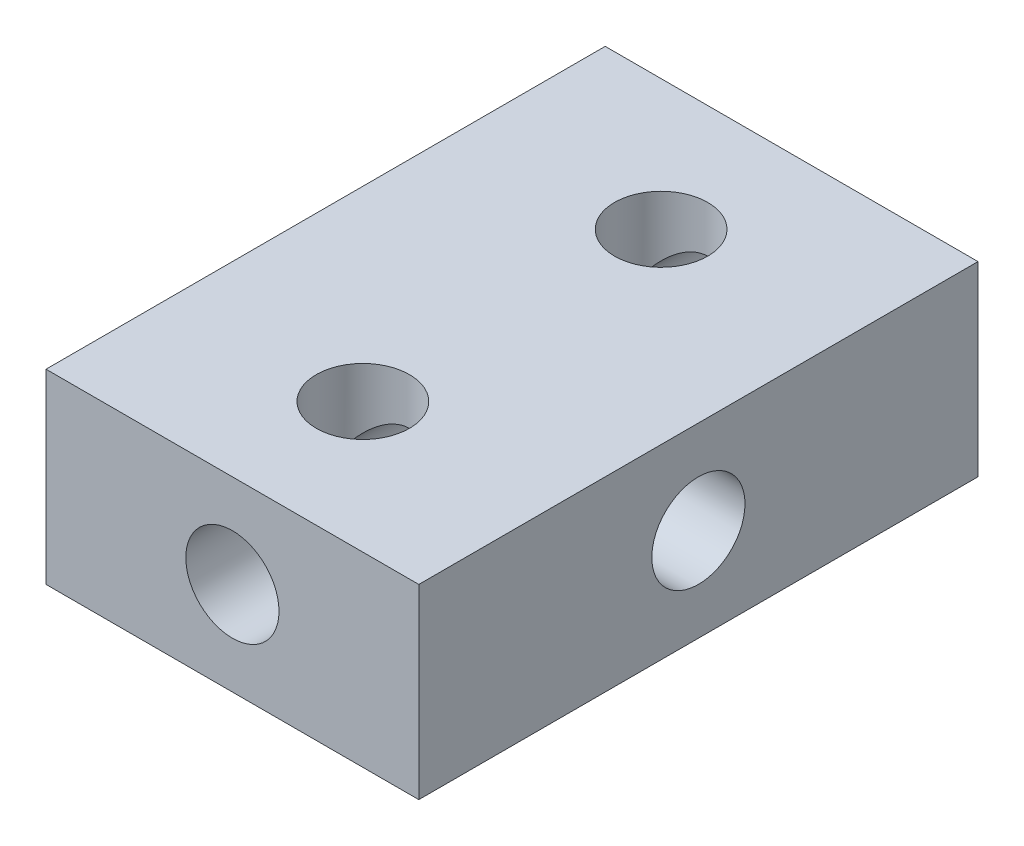
ISO-10303-21;
HEADER;
FILE_DESCRIPTION(('STEP AP214'),'2;1');
FILE_NAME('part.step','',(''),(''),'','','');
FILE_SCHEMA(('AUTOMOTIVE_DESIGN { 1 0 10303 214 1 1 1 1 }'));
ENDSEC;
DATA;
#1=APPLICATION_CONTEXT('core data for automotive mechanical design processes');
#2=APPLICATION_PROTOCOL_DEFINITION('international standard','automotive_design',2000,#1);
#3=PRODUCT_CONTEXT('',#1,'mechanical');
#4=PRODUCT('Part','Part','',(#3));
#5=PRODUCT_RELATED_PRODUCT_CATEGORY('part','',(#4));
#6=PRODUCT_DEFINITION_FORMATION('','',#4);
#7=PRODUCT_DEFINITION_CONTEXT('part definition',#1,'design');
#8=PRODUCT_DEFINITION('design','',#6,#7);
#9=PRODUCT_DEFINITION_SHAPE('','',#8);
#10=(LENGTH_UNIT() NAMED_UNIT(*) SI_UNIT(.MILLI.,.METRE.));
#11=(NAMED_UNIT(*) PLANE_ANGLE_UNIT() SI_UNIT($,.RADIAN.));
#12=(NAMED_UNIT(*) SI_UNIT($,.STERADIAN.) SOLID_ANGLE_UNIT());
#13=UNCERTAINTY_MEASURE_WITH_UNIT(LENGTH_MEASURE(1.E-05),#10,'distance_accuracy_value','');
#14=(GEOMETRIC_REPRESENTATION_CONTEXT(3) GLOBAL_UNCERTAINTY_ASSIGNED_CONTEXT((#13)) GLOBAL_UNIT_ASSIGNED_CONTEXT((#10,
#11,#12)) REPRESENTATION_CONTEXT('',''));
#15=CARTESIAN_POINT('',(0.,0.,0.));
#16=DIRECTION('',(0.,0.,1.));
#17=DIRECTION('',(1.,0.,0.));
#18=AXIS2_PLACEMENT_3D('',#15,#16,#17);
#19=CARTESIAN_POINT('',(5.,2.5,15.));
#20=DIRECTION('',(0.,0.,1.));
#21=DIRECTION('',(1.,0.,0.));
#22=AXIS2_PLACEMENT_3D('',#19,#20,#21);
#23=CYLINDRICAL_SURFACE('',#22,1.24999999999999);
#24=CARTESIAN_POINT('',(5.,2.5,15.));
#25=DIRECTION('',(0.,0.,1.));
#26=DIRECTION('',(1.,0.,0.));
#27=AXIS2_PLACEMENT_3D('',#24,#25,#26);
#28=CIRCLE('',#27,1.24999999999999);
#29=CARTESIAN_POINT('',(6.24999999999999,2.5,15.));
#30=VERTEX_POINT('',#29);
#31=EDGE_CURVE('E129',#30,#30,#28,.T.);
#32=ORIENTED_EDGE('',*,*,#31,.T.);
#33=EDGE_LOOP('',(#32));
#34=FACE_BOUND('',#33,.T.);
#35=CARTESIAN_POINT('',(5.,2.5,11.5));
#36=DIRECTION('',(0.,-0.707106781186547,0.707106781186547));
#37=DIRECTION('',(0.,0.707106781186547,0.707106781186547));
#38=AXIS2_PLACEMENT_3D('',#35,#36,#37);
#39=ELLIPSE('',#38,1.76776695296636,1.24999999999999);
#40=CARTESIAN_POINT('',(3.75000000000001,2.5,11.5));
#41=VERTEX_POINT('',#40);
#42=CARTESIAN_POINT('',(6.24999999999999,2.5,11.5));
#43=VERTEX_POINT('',#42);
#44=EDGE_CURVE('E52',#41,#43,#39,.F.);
#45=ORIENTED_EDGE('',*,*,#44,.T.);
#46=CARTESIAN_POINT('',(5.,2.5,11.5));
#47=DIRECTION('',(0.,0.707106781186547,0.707106781186547));
#48=DIRECTION('',(0.,-0.707106781186547,0.707106781186547));
#49=AXIS2_PLACEMENT_3D('',#46,#47,#48);
#50=ELLIPSE('',#49,1.76776695296636,1.24999999999999);
#51=EDGE_CURVE('E100',#43,#41,#50,.F.);
#52=ORIENTED_EDGE('',*,*,#51,.T.);
#53=EDGE_LOOP('',(#45,#52));
#54=FACE_BOUND('',#53,.T.);
#55=ADVANCED_FACE('F38',(#34,#54),#23,.F.);
#56=CARTESIAN_POINT('',(5.,2.5,7.5));
#57=DIRECTION('',(-0.707106781186547,0.,0.707106781186547));
#58=DIRECTION('',(0.707106781186547,0.,0.707106781186547));
#59=AXIS2_PLACEMENT_3D('',#56,#57,#58);
#60=ELLIPSE('',#59,1.76776695296636,1.24999999999999);
#61=CARTESIAN_POINT('',(5.,3.74999999999999,7.5));
#62=VERTEX_POINT('',#61);
#63=CARTESIAN_POINT('',(5.,1.25000000000001,7.5));
#64=VERTEX_POINT('',#63);
#65=EDGE_CURVE('E164',#62,#64,#60,.T.);
#66=ORIENTED_EDGE('',*,*,#65,.T.);
#67=CARTESIAN_POINT('',(5.,2.5,7.5));
#68=DIRECTION('',(0.707106781186547,0.,0.707106781186547));
#69=DIRECTION('',(-0.707106781186547,0.,0.707106781186547));
#70=AXIS2_PLACEMENT_3D('',#67,#68,#69);
#71=ELLIPSE('',#70,1.76776695296636,1.24999999999999);
#72=EDGE_CURVE('E167',#64,#62,#71,.T.);
#73=ORIENTED_EDGE('',*,*,#72,.T.);
#74=EDGE_LOOP('',(#66,#73));
#75=FACE_BOUND('',#74,.T.);
#76=CARTESIAN_POINT('',(5.,2.5,3.5));
#77=DIRECTION('',(0.,-0.707106781186547,0.707106781186547));
#78=DIRECTION('',(0.,0.707106781186547,0.707106781186547));
#79=AXIS2_PLACEMENT_3D('',#76,#77,#78);
#80=ELLIPSE('',#79,1.76776695296636,1.24999999999999);
#81=CARTESIAN_POINT('',(3.75000000000001,2.5,3.5));
#82=VERTEX_POINT('',#81);
#83=CARTESIAN_POINT('',(6.24999999999999,2.5,3.5));
#84=VERTEX_POINT('',#83);
#85=EDGE_CURVE('E58',#82,#84,#80,.F.);
#86=ORIENTED_EDGE('',*,*,#85,.T.);
#87=CARTESIAN_POINT('',(5.,2.5,3.5));
#88=DIRECTION('',(0.,0.707106781186547,0.707106781186547));
#89=DIRECTION('',(0.,-0.707106781186547,0.707106781186547));
#90=AXIS2_PLACEMENT_3D('',#87,#88,#89);
#91=ELLIPSE('',#90,1.76776695296636,1.24999999999999);
#92=EDGE_CURVE('E11',#84,#82,#91,.F.);
#93=ORIENTED_EDGE('',*,*,#92,.T.);
#94=EDGE_LOOP('',(#86,#93));
#95=FACE_BOUND('',#94,.T.);
#96=ADVANCED_FACE('F185',(#75,#95),#23,.F.);
#97=CARTESIAN_POINT('',(5.,2.5,11.5));
#98=DIRECTION('',(0.,-0.707106781186547,0.707106781186547));
#99=DIRECTION('',(0.,0.707106781186547,0.707106781186547));
#100=AXIS2_PLACEMENT_3D('',#97,#98,#99);
#101=ELLIPSE('',#100,1.76776695296636,1.24999999999999);
#102=EDGE_CURVE('E98',#41,#43,#101,.T.);
#103=ORIENTED_EDGE('',*,*,#102,.T.);
#104=CARTESIAN_POINT('',(5.,2.5,11.5));
#105=DIRECTION('',(0.,0.707106781186547,0.707106781186547));
#106=DIRECTION('',(0.,-0.707106781186547,0.707106781186547));
#107=AXIS2_PLACEMENT_3D('',#104,#105,#106);
#108=ELLIPSE('',#107,1.76776695296636,1.24999999999999);
#109=EDGE_CURVE('E103',#43,#41,#108,.T.);
#110=ORIENTED_EDGE('',*,*,#109,.T.);
#111=EDGE_LOOP('',(#103,#110));
#112=FACE_BOUND('',#111,.T.);
#113=CARTESIAN_POINT('',(5.,2.5,7.5));
#114=DIRECTION('',(-0.707106781186547,0.,0.707106781186547));
#115=DIRECTION('',(0.707106781186547,0.,0.707106781186547));
#116=AXIS2_PLACEMENT_3D('',#113,#114,#115);
#117=ELLIPSE('',#116,1.76776695296636,1.24999999999999);
#118=EDGE_CURVE('E162',#62,#64,#117,.F.);
#119=ORIENTED_EDGE('',*,*,#118,.T.);
#120=CARTESIAN_POINT('',(5.,2.5,7.5));
#121=DIRECTION('',(0.707106781186547,0.,0.707106781186547));
#122=DIRECTION('',(-0.707106781186547,0.,0.707106781186547));
#123=AXIS2_PLACEMENT_3D('',#120,#121,#122);
#124=ELLIPSE('',#123,1.76776695296636,1.24999999999999);
#125=EDGE_CURVE('E170',#64,#62,#124,.F.);
#126=ORIENTED_EDGE('',*,*,#125,.T.);
#127=EDGE_LOOP('',(#119,#126));
#128=FACE_BOUND('',#127,.T.);
#129=ADVANCED_FACE('F111',(#112,#128),#23,.F.);
#130=CARTESIAN_POINT('',(0.,5.,15.));
#131=DIRECTION('',(1.,0.,0.));
#132=DIRECTION('',(0.,1.,0.));
#133=AXIS2_PLACEMENT_3D('',#130,#131,#132);
#134=PLANE('',#133);
#135=CARTESIAN_POINT('',(0.,2.5,7.5));
#136=DIRECTION('',(1.,0.,0.));
#137=DIRECTION('',(0.,0.,-1.));
#138=AXIS2_PLACEMENT_3D('',#135,#136,#137);
#139=CIRCLE('',#138,1.25);
#140=CARTESIAN_POINT('',(0.,2.5,6.25));
#141=VERTEX_POINT('',#140);
#142=EDGE_CURVE('E120',#141,#141,#139,.T.);
#143=ORIENTED_EDGE('',*,*,#142,.T.);
#144=EDGE_LOOP('',(#143));
#145=FACE_BOUND('',#144,.T.);
#146=DIRECTION('',(0.,-1.,0.));
#147=VECTOR('',#146,1.);
#148=CARTESIAN_POINT('',(0.,5.,0.));
#149=LINE('',#148,#147);
#150=CARTESIAN_POINT('',(0.,5.,0.));
#151=VERTEX_POINT('',#150);
#152=CARTESIAN_POINT('',(0.,0.,0.));
#153=VERTEX_POINT('',#152);
#154=EDGE_CURVE('E132',#151,#153,#149,.T.);
#155=ORIENTED_EDGE('',*,*,#154,.T.);
#156=DIRECTION('',(0.,0.,-1.));
#157=VECTOR('',#156,1.);
#158=CARTESIAN_POINT('',(0.,0.,15.));
#159=LINE('',#158,#157);
#160=CARTESIAN_POINT('',(0.,0.,15.));
#161=VERTEX_POINT('',#160);
#162=EDGE_CURVE('E159',#161,#153,#159,.T.);
#163=ORIENTED_EDGE('',*,*,#162,.F.);
#164=DIRECTION('',(0.,-1.,0.));
#165=VECTOR('',#164,1.);
#166=CARTESIAN_POINT('',(0.,5.,15.));
#167=LINE('',#166,#165);
#168=CARTESIAN_POINT('',(0.,5.,15.));
#169=VERTEX_POINT('',#168);
#170=EDGE_CURVE('E141',#169,#161,#167,.T.);
#171=ORIENTED_EDGE('',*,*,#170,.F.);
#172=DIRECTION('',(0.,0.,-1.));
#173=VECTOR('',#172,1.);
#174=CARTESIAN_POINT('',(0.,5.,15.));
#175=LINE('',#174,#173);
#176=EDGE_CURVE('E150',#169,#151,#175,.T.);
#177=ORIENTED_EDGE('',*,*,#176,.T.);
#178=EDGE_LOOP('',(#155,#163,#171,#177));
#179=FACE_BOUND('',#178,.T.);
#180=ADVANCED_FACE('F40',(#145,#179),#134,.F.);
#181=CARTESIAN_POINT('',(0.,0.,15.));
#182=DIRECTION('',(0.,1.,0.));
#183=DIRECTION('',(0.,0.,1.));
#184=AXIS2_PLACEMENT_3D('',#181,#182,#183);
#185=PLANE('',#184);
#186=CARTESIAN_POINT('',(5.,0.,11.5));
#187=DIRECTION('',(0.,1.,0.));
#188=DIRECTION('',(0.,0.,1.));
#189=AXIS2_PLACEMENT_3D('',#186,#187,#188);
#190=CIRCLE('',#189,1.25);
#191=CARTESIAN_POINT('',(5.,0.,12.75));
#192=VERTEX_POINT('',#191);
#193=EDGE_CURVE('E225',#192,#192,#190,.T.);
#194=ORIENTED_EDGE('',*,*,#193,.T.);
#195=EDGE_LOOP('',(#194));
#196=FACE_BOUND('',#195,.T.);
#197=CARTESIAN_POINT('',(5.,0.,3.5));
#198=DIRECTION('',(0.,1.,0.));
#199=DIRECTION('',(0.,0.,1.));
#200=AXIS2_PLACEMENT_3D('',#197,#198,#199);
#201=CIRCLE('',#200,1.25);
#202=CARTESIAN_POINT('',(5.,0.,4.75));
#203=VERTEX_POINT('',#202);
#204=EDGE_CURVE('E109',#203,#203,#201,.T.);
#205=ORIENTED_EDGE('',*,*,#204,.T.);
#206=EDGE_LOOP('',(#205));
#207=FACE_BOUND('',#206,.T.);
#208=DIRECTION('',(1.,0.,0.));
#209=VECTOR('',#208,1.);
#210=CARTESIAN_POINT('',(0.,0.,0.));
#211=LINE('',#210,#209);
#212=CARTESIAN_POINT('',(10.,0.,0.));
#213=VERTEX_POINT('',#212);
#214=EDGE_CURVE('E135',#153,#213,#211,.T.);
#215=ORIENTED_EDGE('',*,*,#214,.T.);
#216=DIRECTION('',(0.,0.,-1.));
#217=VECTOR('',#216,1.);
#218=CARTESIAN_POINT('',(10.,0.,15.));
#219=LINE('',#218,#217);
#220=CARTESIAN_POINT('',(10.,0.,15.));
#221=VERTEX_POINT('',#220);
#222=EDGE_CURVE('E156',#221,#213,#219,.T.);
#223=ORIENTED_EDGE('',*,*,#222,.F.);
#224=DIRECTION('',(1.,0.,0.));
#225=VECTOR('',#224,1.);
#226=CARTESIAN_POINT('',(0.,0.,15.));
#227=LINE('',#226,#225);
#228=EDGE_CURVE('E144',#161,#221,#227,.T.);
#229=ORIENTED_EDGE('',*,*,#228,.F.);
#230=ORIENTED_EDGE('',*,*,#162,.T.);
#231=EDGE_LOOP('',(#215,#223,#229,#230));
#232=FACE_BOUND('',#231,.T.);
#233=ADVANCED_FACE('F214',(#196,#207,#232),#185,.F.);
#234=CARTESIAN_POINT('',(10.,5.,15.));
#235=DIRECTION('',(-1.,0.,0.));
#236=DIRECTION('',(0.,0.,1.));
#237=AXIS2_PLACEMENT_3D('',#234,#235,#236);
#238=PLANE('',#237);
#239=CARTESIAN_POINT('',(10.,2.5,7.5));
#240=DIRECTION('',(1.,0.,0.));
#241=DIRECTION('',(0.,0.,-1.));
#242=AXIS2_PLACEMENT_3D('',#239,#240,#241);
#243=CIRCLE('',#242,1.24999999999999);
#244=CARTESIAN_POINT('',(10.,2.5,6.25000000000001));
#245=VERTEX_POINT('',#244);
#246=EDGE_CURVE('E123',#245,#245,#243,.T.);
#247=ORIENTED_EDGE('',*,*,#246,.F.);
#248=EDGE_LOOP('',(#247));
#249=FACE_BOUND('',#248,.T.);
#250=DIRECTION('',(0.,1.,0.));
#251=VECTOR('',#250,1.);
#252=CARTESIAN_POINT('',(10.,5.,0.));
#253=LINE('',#252,#251);
#254=CARTESIAN_POINT('',(10.,5.,0.));
#255=VERTEX_POINT('',#254);
#256=EDGE_CURVE('E137',#213,#255,#253,.T.);
#257=ORIENTED_EDGE('',*,*,#256,.T.);
#258=DIRECTION('',(0.,0.,-1.));
#259=VECTOR('',#258,1.);
#260=CARTESIAN_POINT('',(10.,5.,15.));
#261=LINE('',#260,#259);
#262=CARTESIAN_POINT('',(10.,5.,15.));
#263=VERTEX_POINT('',#262);
#264=EDGE_CURVE('E153',#263,#255,#261,.T.);
#265=ORIENTED_EDGE('',*,*,#264,.F.);
#266=DIRECTION('',(0.,1.,0.));
#267=VECTOR('',#266,1.);
#268=CARTESIAN_POINT('',(10.,5.,15.));
#269=LINE('',#268,#267);
#270=EDGE_CURVE('E146',#221,#263,#269,.T.);
#271=ORIENTED_EDGE('',*,*,#270,.F.);
#272=ORIENTED_EDGE('',*,*,#222,.T.);
#273=EDGE_LOOP('',(#257,#265,#271,#272));
#274=FACE_BOUND('',#273,.T.);
#275=ADVANCED_FACE('F211',(#249,#274),#238,.F.);
#276=CARTESIAN_POINT('',(0.,5.,15.));
#277=DIRECTION('',(0.,-1.,0.));
#278=DIRECTION('',(0.,0.,-1.));
#279=AXIS2_PLACEMENT_3D('',#276,#277,#278);
#280=PLANE('',#279);
#281=CARTESIAN_POINT('',(5.,5.,11.5));
#282=DIRECTION('',(0.,1.,0.));
#283=DIRECTION('',(0.,0.,1.));
#284=AXIS2_PLACEMENT_3D('',#281,#282,#283);
#285=CIRCLE('',#284,1.24999999999999);
#286=CARTESIAN_POINT('',(5.,5.,12.75));
#287=VERTEX_POINT('',#286);
#288=EDGE_CURVE('E107',#287,#287,#285,.T.);
#289=ORIENTED_EDGE('',*,*,#288,.F.);
#290=EDGE_LOOP('',(#289));
#291=FACE_BOUND('',#290,.T.);
#292=CARTESIAN_POINT('',(5.,5.,3.5));
#293=DIRECTION('',(0.,1.,0.));
#294=DIRECTION('',(0.,0.,1.));
#295=AXIS2_PLACEMENT_3D('',#292,#293,#294);
#296=CIRCLE('',#295,1.24999999999999);
#297=CARTESIAN_POINT('',(5.,5.,4.74999999999999));
#298=VERTEX_POINT('',#297);
#299=EDGE_CURVE('E117',#298,#298,#296,.T.);
#300=ORIENTED_EDGE('',*,*,#299,.F.);
#301=EDGE_LOOP('',(#300));
#302=FACE_BOUND('',#301,.T.);
#303=DIRECTION('',(-1.,0.,0.));
#304=VECTOR('',#303,1.);
#305=CARTESIAN_POINT('',(0.,5.,0.));
#306=LINE('',#305,#304);
#307=EDGE_CURVE('E139',#255,#151,#306,.T.);
#308=ORIENTED_EDGE('',*,*,#307,.T.);
#309=ORIENTED_EDGE('',*,*,#176,.F.);
#310=DIRECTION('',(-1.,0.,0.));
#311=VECTOR('',#310,1.);
#312=CARTESIAN_POINT('',(0.,5.,15.));
#313=LINE('',#312,#311);
#314=EDGE_CURVE('E148',#263,#169,#313,.T.);
#315=ORIENTED_EDGE('',*,*,#314,.F.);
#316=ORIENTED_EDGE('',*,*,#264,.T.);
#317=EDGE_LOOP('',(#308,#309,#315,#316));
#318=FACE_BOUND('',#317,.T.);
#319=ADVANCED_FACE('F207',(#291,#302,#318),#280,.F.);
#320=CARTESIAN_POINT('',(0.,0.,15.));
#321=DIRECTION('',(0.,0.,1.));
#322=DIRECTION('',(1.,0.,0.));
#323=AXIS2_PLACEMENT_3D('',#320,#321,#322);
#324=PLANE('',#323);
#325=ORIENTED_EDGE('',*,*,#31,.F.);
#326=EDGE_LOOP('',(#325));
#327=FACE_BOUND('',#326,.T.);
#328=ORIENTED_EDGE('',*,*,#170,.T.);
#329=ORIENTED_EDGE('',*,*,#228,.T.);
#330=ORIENTED_EDGE('',*,*,#270,.T.);
#331=ORIENTED_EDGE('',*,*,#314,.T.);
#332=EDGE_LOOP('',(#328,#329,#330,#331));
#333=FACE_BOUND('',#332,.T.);
#334=ADVANCED_FACE('F203',(#327,#333),#324,.T.);
#335=CARTESIAN_POINT('',(0.,0.,0.));
#336=DIRECTION('',(0.,0.,1.));
#337=DIRECTION('',(1.,0.,0.));
#338=AXIS2_PLACEMENT_3D('',#335,#336,#337);
#339=PLANE('',#338);
#340=CARTESIAN_POINT('',(5.,2.5,0.));
#341=DIRECTION('',(0.,0.,1.));
#342=DIRECTION('',(1.,0.,0.));
#343=AXIS2_PLACEMENT_3D('',#340,#341,#342);
#344=CIRCLE('',#343,1.25);
#345=CARTESIAN_POINT('',(6.25,2.5,0.));
#346=VERTEX_POINT('',#345);
#347=EDGE_CURVE('E126',#346,#346,#344,.T.);
#348=ORIENTED_EDGE('',*,*,#347,.T.);
#349=EDGE_LOOP('',(#348));
#350=FACE_BOUND('',#349,.T.);
#351=ORIENTED_EDGE('',*,*,#154,.F.);
#352=ORIENTED_EDGE('',*,*,#307,.F.);
#353=ORIENTED_EDGE('',*,*,#256,.F.);
#354=ORIENTED_EDGE('',*,*,#214,.F.);
#355=EDGE_LOOP('',(#351,#352,#353,#354));
#356=FACE_BOUND('',#355,.T.);
#357=ADVANCED_FACE('F198',(#350,#356),#339,.F.);
#358=CARTESIAN_POINT('',(5.,2.5,3.5));
#359=DIRECTION('',(0.,-0.707106781186547,0.707106781186547));
#360=DIRECTION('',(0.,0.707106781186547,0.707106781186547));
#361=AXIS2_PLACEMENT_3D('',#358,#359,#360);
#362=ELLIPSE('',#361,1.76776695296636,1.24999999999999);
#363=EDGE_CURVE('E174',#82,#84,#362,.T.);
#364=ORIENTED_EDGE('',*,*,#363,.T.);
#365=CARTESIAN_POINT('',(5.,2.5,3.5));
#366=DIRECTION('',(0.,0.707106781186547,0.707106781186547));
#367=DIRECTION('',(0.,-0.707106781186547,0.707106781186547));
#368=AXIS2_PLACEMENT_3D('',#365,#366,#367);
#369=ELLIPSE('',#368,1.76776695296636,1.24999999999999);
#370=EDGE_CURVE('E46',#84,#82,#369,.T.);
#371=ORIENTED_EDGE('',*,*,#370,.T.);
#372=EDGE_LOOP('',(#364,#371));
#373=FACE_BOUND('',#372,.T.);
#374=ORIENTED_EDGE('',*,*,#347,.F.);
#375=EDGE_LOOP('',(#374));
#376=FACE_BOUND('',#375,.T.);
#377=ADVANCED_FACE('F178',(#373,#376),#23,.F.);
#378=CARTESIAN_POINT('',(10.,2.5,7.5));
#379=DIRECTION('',(1.,0.,0.));
#380=DIRECTION('',(0.,0.,-1.));
#381=AXIS2_PLACEMENT_3D('',#378,#379,#380);
#382=CYLINDRICAL_SURFACE('',#381,1.24999999999999);
#383=ORIENTED_EDGE('',*,*,#246,.T.);
#384=EDGE_LOOP('',(#383));
#385=FACE_BOUND('',#384,.T.);
#386=ORIENTED_EDGE('',*,*,#118,.F.);
#387=ORIENTED_EDGE('',*,*,#72,.F.);
#388=EDGE_LOOP('',(#386,#387));
#389=FACE_BOUND('',#388,.T.);
#390=ADVANCED_FACE('F197',(#385,#389),#382,.F.);
#391=ORIENTED_EDGE('',*,*,#142,.F.);
#392=EDGE_LOOP('',(#391));
#393=FACE_BOUND('',#392,.T.);
#394=ORIENTED_EDGE('',*,*,#65,.F.);
#395=ORIENTED_EDGE('',*,*,#125,.F.);
#396=EDGE_LOOP('',(#394,#395));
#397=FACE_BOUND('',#396,.T.);
#398=ADVANCED_FACE('F199',(#393,#397),#382,.F.);
#399=CARTESIAN_POINT('',(5.,5.,3.5));
#400=DIRECTION('',(0.,1.,0.));
#401=DIRECTION('',(0.,0.,1.));
#402=AXIS2_PLACEMENT_3D('',#399,#400,#401);
#403=CYLINDRICAL_SURFACE('',#402,1.24999999999999);
#404=ORIENTED_EDGE('',*,*,#299,.T.);
#405=EDGE_LOOP('',(#404));
#406=FACE_BOUND('',#405,.T.);
#407=ORIENTED_EDGE('',*,*,#85,.F.);
#408=ORIENTED_EDGE('',*,*,#370,.F.);
#409=EDGE_LOOP('',(#407,#408));
#410=FACE_BOUND('',#409,.T.);
#411=ADVANCED_FACE('F182',(#406,#410),#403,.F.);
#412=ORIENTED_EDGE('',*,*,#204,.F.);
#413=EDGE_LOOP('',(#412));
#414=FACE_BOUND('',#413,.T.);
#415=ORIENTED_EDGE('',*,*,#363,.F.);
#416=ORIENTED_EDGE('',*,*,#92,.F.);
#417=EDGE_LOOP('',(#415,#416));
#418=FACE_BOUND('',#417,.T.);
#419=ADVANCED_FACE('F184',(#414,#418),#403,.F.);
#420=CARTESIAN_POINT('',(5.,5.,11.5));
#421=DIRECTION('',(0.,1.,0.));
#422=DIRECTION('',(0.,0.,1.));
#423=AXIS2_PLACEMENT_3D('',#420,#421,#422);
#424=CYLINDRICAL_SURFACE('',#423,1.24999999999999);
#425=ORIENTED_EDGE('',*,*,#288,.T.);
#426=EDGE_LOOP('',(#425));
#427=FACE_BOUND('',#426,.T.);
#428=ORIENTED_EDGE('',*,*,#44,.F.);
#429=ORIENTED_EDGE('',*,*,#109,.F.);
#430=EDGE_LOOP('',(#428,#429));
#431=FACE_BOUND('',#430,.T.);
#432=ADVANCED_FACE('F106',(#427,#431),#424,.F.);
#433=ORIENTED_EDGE('',*,*,#193,.F.);
#434=EDGE_LOOP('',(#433));
#435=FACE_BOUND('',#434,.T.);
#436=ORIENTED_EDGE('',*,*,#102,.F.);
#437=ORIENTED_EDGE('',*,*,#51,.F.);
#438=EDGE_LOOP('',(#436,#437));
#439=FACE_BOUND('',#438,.T.);
#440=ADVANCED_FACE('F99',(#435,#439),#424,.F.);
#441=CLOSED_SHELL('',(#55,#96,#129,#180,#233,#275,#319,#334,#357,#377,#390,#398,#411,#419,#432,#440));
#442=MANIFOLD_SOLID_BREP('B2',#441);
#443=ADVANCED_BREP_SHAPE_REPRESENTATION('',(#18,#442),#14);
#444=SHAPE_DEFINITION_REPRESENTATION(#9,#443);
ENDSEC;
END-ISO-10303-21;
